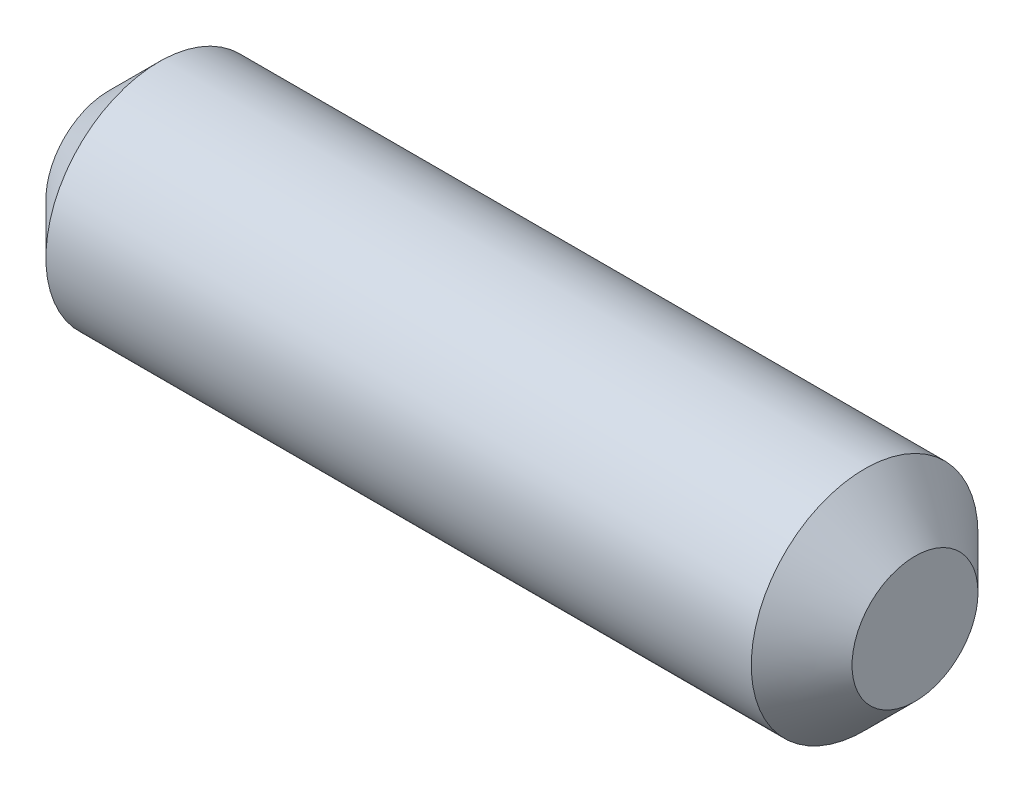
ISO-10303-21;
HEADER;
FILE_DESCRIPTION(('STEP AP214'),'2;1');
FILE_NAME('part.step','',(''),(''),'','','');
FILE_SCHEMA(('AUTOMOTIVE_DESIGN { 1 0 10303 214 1 1 1 1 }'));
ENDSEC;
DATA;
#1=APPLICATION_CONTEXT('core data for automotive mechanical design processes');
#2=APPLICATION_PROTOCOL_DEFINITION('international standard','automotive_design',2000,#1);
#3=PRODUCT_CONTEXT('',#1,'mechanical');
#4=PRODUCT('Part','Part','',(#3));
#5=PRODUCT_RELATED_PRODUCT_CATEGORY('part','',(#4));
#6=PRODUCT_DEFINITION_FORMATION('','',#4);
#7=PRODUCT_DEFINITION_CONTEXT('part definition',#1,'design');
#8=PRODUCT_DEFINITION('design','',#6,#7);
#9=PRODUCT_DEFINITION_SHAPE('','',#8);
#10=(LENGTH_UNIT() NAMED_UNIT(*) SI_UNIT(.MILLI.,.METRE.));
#11=(NAMED_UNIT(*) PLANE_ANGLE_UNIT() SI_UNIT($,.RADIAN.));
#12=(NAMED_UNIT(*) SI_UNIT($,.STERADIAN.) SOLID_ANGLE_UNIT());
#13=UNCERTAINTY_MEASURE_WITH_UNIT(LENGTH_MEASURE(1.E-05),#10,'distance_accuracy_value','');
#14=(GEOMETRIC_REPRESENTATION_CONTEXT(3) GLOBAL_UNCERTAINTY_ASSIGNED_CONTEXT((#13)) GLOBAL_UNIT_ASSIGNED_CONTEXT((#10,
#11,#12)) REPRESENTATION_CONTEXT('',''));
#15=CARTESIAN_POINT('',(0.,0.,0.));
#16=DIRECTION('',(0.,0.,1.));
#17=DIRECTION('',(1.,0.,0.));
#18=AXIS2_PLACEMENT_3D('',#15,#16,#17);
#19=CARTESIAN_POINT('',(1.6,0.,0.));
#20=DIRECTION('',(1.,0.,0.));
#21=DIRECTION('',(0.,0.,-1.));
#22=AXIS2_PLACEMENT_3D('',#19,#20,#21);
#23=PLANE('',#22);
#24=CARTESIAN_POINT('',(1.6,0.,0.));
#25=DIRECTION('',(1.,0.,0.));
#26=DIRECTION('',(0.,0.,-1.));
#27=AXIS2_PLACEMENT_3D('',#24,#25,#26);
#28=CIRCLE('',#27,1.);
#29=CARTESIAN_POINT('',(1.6,0.,-1.));
#30=VERTEX_POINT('',#29);
#31=EDGE_CURVE('E60',#30,#30,#28,.F.);
#32=ORIENTED_EDGE('',*,*,#31,.T.);
#33=EDGE_LOOP('',(#32));
#34=FACE_BOUND('',#33,.T.);
#35=ADVANCED_FACE('F52',(#34),#23,.F.);
#36=CARTESIAN_POINT('',(14.4,0.,0.));
#37=DIRECTION('',(1.,0.,0.));
#38=DIRECTION('',(0.,0.,-1.));
#39=AXIS2_PLACEMENT_3D('',#36,#37,#38);
#40=PLANE('',#39);
#41=CARTESIAN_POINT('',(14.4,0.,0.));
#42=DIRECTION('',(1.,0.,0.));
#43=DIRECTION('',(0.,0.,-1.));
#44=AXIS2_PLACEMENT_3D('',#41,#42,#43);
#45=CIRCLE('',#44,1.);
#46=CARTESIAN_POINT('',(14.4,0.,-1.));
#47=VERTEX_POINT('',#46);
#48=EDGE_CURVE('E12',#47,#47,#45,.T.);
#49=ORIENTED_EDGE('',*,*,#48,.T.);
#50=EDGE_LOOP('',(#49));
#51=FACE_BOUND('',#50,.T.);
#52=ADVANCED_FACE('F87',(#51),#40,.T.);
#53=CARTESIAN_POINT('',(1.6,0.,0.));
#54=DIRECTION('',(1.,0.,0.));
#55=DIRECTION('',(0.,0.,-1.));
#56=AXIS2_PLACEMENT_3D('',#53,#54,#55);
#57=CYLINDRICAL_SURFACE('',#56,1.8);
#58=CARTESIAN_POINT('',(2.4,0.,0.));
#59=DIRECTION('',(1.,0.,0.));
#60=DIRECTION('',(0.,0.,-1.));
#61=AXIS2_PLACEMENT_3D('',#58,#59,#60);
#62=CIRCLE('',#61,1.8);
#63=CARTESIAN_POINT('',(2.4,0.,-1.8));
#64=VERTEX_POINT('',#63);
#65=EDGE_CURVE('E65',#64,#64,#62,.T.);
#66=ORIENTED_EDGE('',*,*,#65,.T.);
#67=EDGE_LOOP('',(#66));
#68=FACE_BOUND('',#67,.T.);
#69=CARTESIAN_POINT('',(13.6,0.,0.));
#70=DIRECTION('',(1.,0.,0.));
#71=DIRECTION('',(0.,0.,-1.));
#72=AXIS2_PLACEMENT_3D('',#69,#70,#71);
#73=CIRCLE('',#72,1.8);
#74=CARTESIAN_POINT('',(13.6,0.,-1.8));
#75=VERTEX_POINT('',#74);
#76=EDGE_CURVE('E70',#75,#75,#73,.F.);
#77=ORIENTED_EDGE('',*,*,#76,.T.);
#78=EDGE_LOOP('',(#77));
#79=FACE_BOUND('',#78,.T.);
#80=ADVANCED_FACE('F77',(#68,#79),#57,.T.);
#81=CARTESIAN_POINT('',(2.4,0.,0.));
#82=DIRECTION('',(1.,0.,0.));
#83=DIRECTION('',(0.,0.,-1.));
#84=AXIS2_PLACEMENT_3D('',#81,#82,#83);
#85=CONICAL_SURFACE('',#84,1.8,0.78539816339745);
#86=ORIENTED_EDGE('',*,*,#31,.F.);
#87=EDGE_LOOP('',(#86));
#88=FACE_BOUND('',#87,.T.);
#89=ORIENTED_EDGE('',*,*,#65,.F.);
#90=EDGE_LOOP('',(#89));
#91=FACE_BOUND('',#90,.T.);
#92=ADVANCED_FACE('F81',(#88,#91),#85,.T.);
#93=CARTESIAN_POINT('',(14.4,0.,0.));
#94=DIRECTION('',(-1.,0.,0.));
#95=DIRECTION('',(0.,0.,1.));
#96=AXIS2_PLACEMENT_3D('',#93,#94,#95);
#97=CONICAL_SURFACE('',#96,1.,0.785398163397447);
#98=ORIENTED_EDGE('',*,*,#76,.F.);
#99=EDGE_LOOP('',(#98));
#100=FACE_BOUND('',#99,.T.);
#101=ORIENTED_EDGE('',*,*,#48,.F.);
#102=EDGE_LOOP('',(#101));
#103=FACE_BOUND('',#102,.T.);
#104=ADVANCED_FACE('F54',(#100,#103),#97,.T.);
#105=CLOSED_SHELL('',(#35,#52,#80,#92,#104));
#106=MANIFOLD_SOLID_BREP('B2',#105);
#107=ADVANCED_BREP_SHAPE_REPRESENTATION('',(#18,#106),#14);
#108=SHAPE_DEFINITION_REPRESENTATION(#9,#107);
ENDSEC;
END-ISO-10303-21;
